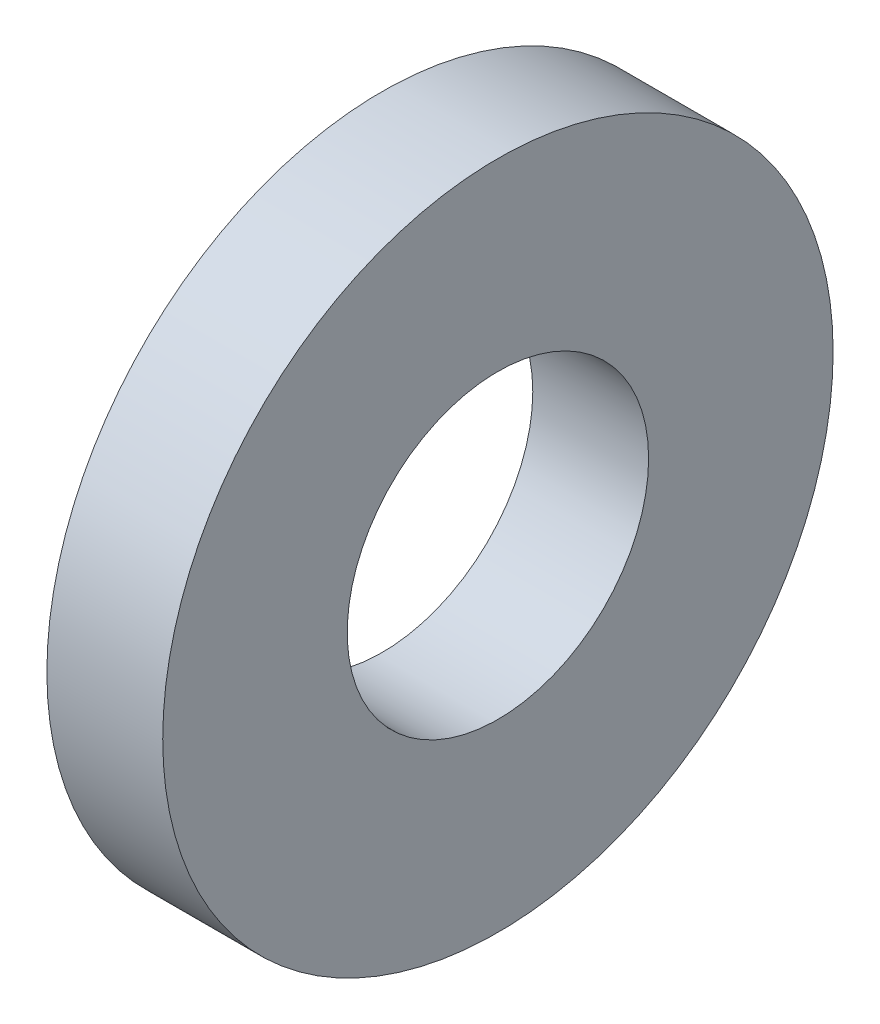
ISO-10303-21;
HEADER;
FILE_DESCRIPTION(('STEP AP214'),'2;1');
FILE_NAME('part.step','',(''),(''),'','','');
FILE_SCHEMA(('AUTOMOTIVE_DESIGN { 1 0 10303 214 1 1 1 1 }'));
ENDSEC;
DATA;
#1=APPLICATION_CONTEXT('core data for automotive mechanical design processes');
#2=APPLICATION_PROTOCOL_DEFINITION('international standard','automotive_design',2000,#1);
#3=PRODUCT_CONTEXT('',#1,'mechanical');
#4=PRODUCT('Part','Part','',(#3));
#5=PRODUCT_RELATED_PRODUCT_CATEGORY('part','',(#4));
#6=PRODUCT_DEFINITION_FORMATION('','',#4);
#7=PRODUCT_DEFINITION_CONTEXT('part definition',#1,'design');
#8=PRODUCT_DEFINITION('design','',#6,#7);
#9=PRODUCT_DEFINITION_SHAPE('','',#8);
#10=(LENGTH_UNIT() NAMED_UNIT(*) SI_UNIT(.MILLI.,.METRE.));
#11=(NAMED_UNIT(*) PLANE_ANGLE_UNIT() SI_UNIT($,.RADIAN.));
#12=(NAMED_UNIT(*) SI_UNIT($,.STERADIAN.) SOLID_ANGLE_UNIT());
#13=UNCERTAINTY_MEASURE_WITH_UNIT(LENGTH_MEASURE(1.E-05),#10,'distance_accuracy_value','');
#14=(GEOMETRIC_REPRESENTATION_CONTEXT(3) GLOBAL_UNCERTAINTY_ASSIGNED_CONTEXT((#13)) GLOBAL_UNIT_ASSIGNED_CONTEXT((#10,
#11,#12)) REPRESENTATION_CONTEXT('',''));
#15=CARTESIAN_POINT('',(0.,0.,0.));
#16=DIRECTION('',(0.,0.,1.));
#17=DIRECTION('',(1.,0.,0.));
#18=AXIS2_PLACEMENT_3D('',#15,#16,#17);
#19=CARTESIAN_POINT('',(2.7432,0.,0.));
#20=DIRECTION('',(1.,0.,0.));
#21=DIRECTION('',(0.,0.,-1.));
#22=AXIS2_PLACEMENT_3D('',#19,#20,#21);
#23=PLANE('',#22);
#24=CARTESIAN_POINT('',(2.7432,0.,0.));
#25=DIRECTION('',(1.,0.,0.));
#26=DIRECTION('',(0.,0.,-1.));
#27=AXIS2_PLACEMENT_3D('',#24,#25,#26);
#28=CIRCLE('',#27,7.9375);
#29=CARTESIAN_POINT('',(2.7432,0.,-7.9375));
#30=VERTEX_POINT('',#29);
#31=EDGE_CURVE('E10',#30,#30,#28,.T.);
#32=ORIENTED_EDGE('',*,*,#31,.T.);
#33=EDGE_LOOP('',(#32));
#34=FACE_BOUND('',#33,.T.);
#35=CARTESIAN_POINT('',(2.7432,0.,0.));
#36=DIRECTION('',(1.,0.,0.));
#37=DIRECTION('',(0.,0.,-1.));
#38=AXIS2_PLACEMENT_3D('',#35,#36,#37);
#39=CIRCLE('',#38,3.5687);
#40=CARTESIAN_POINT('',(2.7432,0.,-3.5687));
#41=VERTEX_POINT('',#40);
#42=EDGE_CURVE('E43',#41,#41,#39,.T.);
#43=ORIENTED_EDGE('',*,*,#42,.F.);
#44=EDGE_LOOP('',(#43));
#45=FACE_BOUND('',#44,.T.);
#46=ADVANCED_FACE('F32',(#34,#45),#23,.T.);
#47=CARTESIAN_POINT('',(0.,0.,0.));
#48=DIRECTION('',(1.,0.,0.));
#49=DIRECTION('',(0.,0.,-1.));
#50=AXIS2_PLACEMENT_3D('',#47,#48,#49);
#51=PLANE('',#50);
#52=CARTESIAN_POINT('',(0.,0.,0.));
#53=DIRECTION('',(1.,0.,0.));
#54=DIRECTION('',(0.,0.,-1.));
#55=AXIS2_PLACEMENT_3D('',#52,#53,#54);
#56=CIRCLE('',#55,7.9375);
#57=CARTESIAN_POINT('',(0.,0.,-7.9375));
#58=VERTEX_POINT('',#57);
#59=EDGE_CURVE('E36',#58,#58,#56,.T.);
#60=ORIENTED_EDGE('',*,*,#59,.F.);
#61=EDGE_LOOP('',(#60));
#62=FACE_BOUND('',#61,.T.);
#63=CARTESIAN_POINT('',(0.,0.,0.));
#64=DIRECTION('',(1.,0.,0.));
#65=DIRECTION('',(0.,0.,-1.));
#66=AXIS2_PLACEMENT_3D('',#63,#64,#65);
#67=CIRCLE('',#66,3.5687);
#68=CARTESIAN_POINT('',(0.,0.,-3.5687));
#69=VERTEX_POINT('',#68);
#70=EDGE_CURVE('E45',#69,#69,#67,.T.);
#71=ORIENTED_EDGE('',*,*,#70,.T.);
#72=EDGE_LOOP('',(#71));
#73=FACE_BOUND('',#72,.T.);
#74=ADVANCED_FACE('F55',(#62,#73),#51,.F.);
#75=CARTESIAN_POINT('',(2.7432,0.,0.));
#76=DIRECTION('',(-1.,0.,0.));
#77=DIRECTION('',(0.,0.,1.));
#78=AXIS2_PLACEMENT_3D('',#75,#76,#77);
#79=CYLINDRICAL_SURFACE('',#78,7.9375);
#80=ORIENTED_EDGE('',*,*,#31,.F.);
#81=EDGE_LOOP('',(#80));
#82=FACE_BOUND('',#81,.T.);
#83=ORIENTED_EDGE('',*,*,#59,.T.);
#84=EDGE_LOOP('',(#83));
#85=FACE_BOUND('',#84,.T.);
#86=ADVANCED_FACE('F34',(#82,#85),#79,.T.);
#87=CARTESIAN_POINT('',(2.7432,0.,0.));
#88=DIRECTION('',(-1.,0.,0.));
#89=DIRECTION('',(0.,0.,1.));
#90=AXIS2_PLACEMENT_3D('',#87,#88,#89);
#91=CYLINDRICAL_SURFACE('',#90,3.5687);
#92=ORIENTED_EDGE('',*,*,#42,.T.);
#93=EDGE_LOOP('',(#92));
#94=FACE_BOUND('',#93,.T.);
#95=ORIENTED_EDGE('',*,*,#70,.F.);
#96=EDGE_LOOP('',(#95));
#97=FACE_BOUND('',#96,.T.);
#98=ADVANCED_FACE('F51',(#94,#97),#91,.F.);
#99=CLOSED_SHELL('',(#46,#74,#86,#98));
#100=MANIFOLD_SOLID_BREP('B2',#99);
#101=ADVANCED_BREP_SHAPE_REPRESENTATION('',(#18,#100),#14);
#102=SHAPE_DEFINITION_REPRESENTATION(#9,#101);
ENDSEC;
END-ISO-10303-21;
